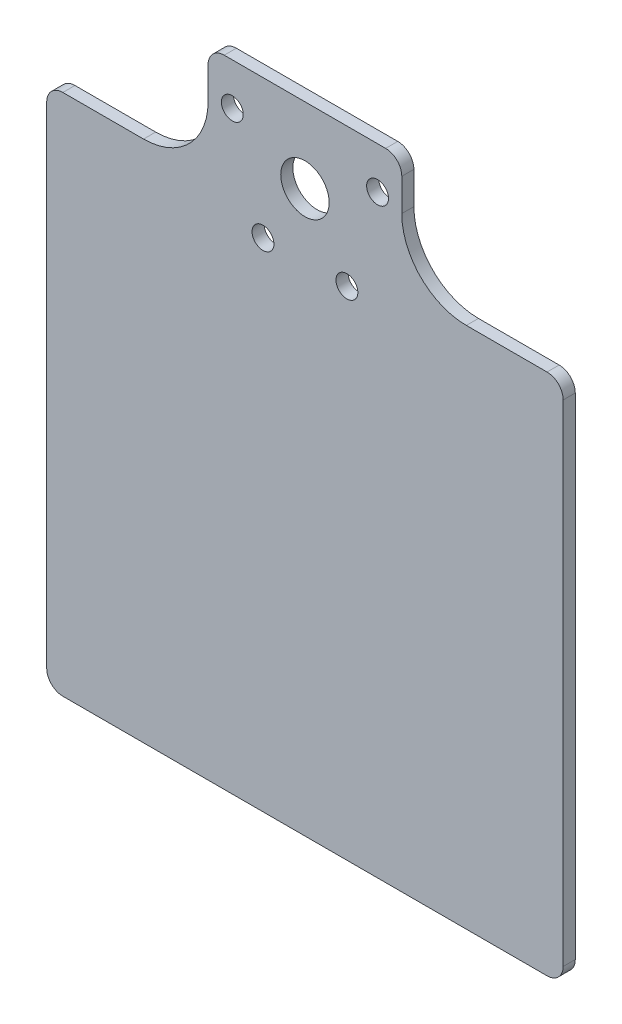
ISO-10303-21;
HEADER;
FILE_DESCRIPTION(('STEP AP214'),'2;1');
FILE_NAME('part.step','',(''),(''),'','','');
FILE_SCHEMA(('AUTOMOTIVE_DESIGN { 1 0 10303 214 1 1 1 1 }'));
ENDSEC;
DATA;
#1=APPLICATION_CONTEXT('core data for automotive mechanical design processes');
#2=APPLICATION_PROTOCOL_DEFINITION('international standard','automotive_design',2000,#1);
#3=PRODUCT_CONTEXT('',#1,'mechanical');
#4=PRODUCT('Part','Part','',(#3));
#5=PRODUCT_RELATED_PRODUCT_CATEGORY('part','',(#4));
#6=PRODUCT_DEFINITION_FORMATION('','',#4);
#7=PRODUCT_DEFINITION_CONTEXT('part definition',#1,'design');
#8=PRODUCT_DEFINITION('design','',#6,#7);
#9=PRODUCT_DEFINITION_SHAPE('','',#8);
#10=(LENGTH_UNIT() NAMED_UNIT(*) SI_UNIT(.MILLI.,.METRE.));
#11=(NAMED_UNIT(*) PLANE_ANGLE_UNIT() SI_UNIT($,.RADIAN.));
#12=(NAMED_UNIT(*) SI_UNIT($,.STERADIAN.) SOLID_ANGLE_UNIT());
#13=UNCERTAINTY_MEASURE_WITH_UNIT(LENGTH_MEASURE(1.E-05),#10,'distance_accuracy_value','');
#14=(GEOMETRIC_REPRESENTATION_CONTEXT(3) GLOBAL_UNCERTAINTY_ASSIGNED_CONTEXT((#13)) GLOBAL_UNIT_ASSIGNED_CONTEXT((#10,
#11,#12)) REPRESENTATION_CONTEXT('',''));
#15=CARTESIAN_POINT('',(0.,0.,0.));
#16=DIRECTION('',(0.,0.,1.));
#17=DIRECTION('',(1.,0.,0.));
#18=AXIS2_PLACEMENT_3D('',#15,#16,#17);
#19=CARTESIAN_POINT('',(19.05,-17.4625,2.38125));
#20=DIRECTION('',(-1.,0.,0.));
#21=DIRECTION('',(0.,0.,1.));
#22=AXIS2_PLACEMENT_3D('',#19,#20,#21);
#23=PLANE('',#22);
#24=DIRECTION('',(0.,1.,0.));
#25=VECTOR('',#24,1.);
#26=CARTESIAN_POINT('',(19.05,-17.4625,2.38125));
#27=LINE('',#26,#25);
#28=CARTESIAN_POINT('',(19.05,7.9375,2.38125));
#29=VERTEX_POINT('',#28);
#30=CARTESIAN_POINT('',(19.05,14.2875,2.38125));
#31=VERTEX_POINT('',#30);
#32=EDGE_CURVE('E214',#29,#31,#27,.T.);
#33=ORIENTED_EDGE('',*,*,#32,.F.);
#34=DIRECTION('',(0.,0.,1.));
#35=VECTOR('',#34,1.);
#36=CARTESIAN_POINT('',(19.05,7.9375,2.38125));
#37=LINE('',#36,#35);
#38=CARTESIAN_POINT('',(19.05,7.9375,0.));
#39=VERTEX_POINT('',#38);
#40=EDGE_CURVE('E210',#29,#39,#37,.F.);
#41=ORIENTED_EDGE('',*,*,#40,.T.);
#42=DIRECTION('',(0.,1.,0.));
#43=VECTOR('',#42,1.);
#44=CARTESIAN_POINT('',(19.05,-17.4625,0.));
#45=LINE('',#44,#43);
#46=CARTESIAN_POINT('',(19.05,14.2875,0.));
#47=VERTEX_POINT('',#46);
#48=EDGE_CURVE('E166',#39,#47,#45,.T.);
#49=ORIENTED_EDGE('',*,*,#48,.T.);
#50=DIRECTION('',(0.,0.,-1.));
#51=VECTOR('',#50,1.);
#52=CARTESIAN_POINT('',(19.05,14.2875,2.38125));
#53=LINE('',#52,#51);
#54=EDGE_CURVE('E204',#47,#31,#53,.F.);
#55=ORIENTED_EDGE('',*,*,#54,.T.);
#56=EDGE_LOOP('',(#33,#41,#49,#55));
#57=FACE_BOUND('',#56,.T.);
#58=ADVANCED_FACE('F32',(#57),#23,.F.);
#59=CARTESIAN_POINT('',(-19.05,17.4625,2.38125));
#60=DIRECTION('',(0.,-1.,0.));
#61=DIRECTION('',(0.,0.,-1.));
#62=AXIS2_PLACEMENT_3D('',#59,#60,#61);
#63=PLANE('',#62);
#64=DIRECTION('',(-1.,0.,0.));
#65=VECTOR('',#64,1.);
#66=CARTESIAN_POINT('',(-19.05,17.4625,0.));
#67=LINE('',#66,#65);
#68=CARTESIAN_POINT('',(15.875,17.4625,0.));
#69=VERTEX_POINT('',#68);
#70=CARTESIAN_POINT('',(-15.875,17.4625,0.));
#71=VERTEX_POINT('',#70);
#72=EDGE_CURVE('E213',#69,#71,#67,.T.);
#73=ORIENTED_EDGE('',*,*,#72,.T.);
#74=DIRECTION('',(0.,0.,-1.));
#75=VECTOR('',#74,1.);
#76=CARTESIAN_POINT('',(-15.875,17.4625,2.38125));
#77=LINE('',#76,#75);
#78=CARTESIAN_POINT('',(-15.875,17.4625,2.38125));
#79=VERTEX_POINT('',#78);
#80=EDGE_CURVE('E202',#71,#79,#77,.F.);
#81=ORIENTED_EDGE('',*,*,#80,.T.);
#82=DIRECTION('',(-1.,0.,0.));
#83=VECTOR('',#82,1.);
#84=CARTESIAN_POINT('',(-19.05,17.4625,2.38125));
#85=LINE('',#84,#83);
#86=CARTESIAN_POINT('',(15.875,17.4625,2.38125));
#87=VERTEX_POINT('',#86);
#88=EDGE_CURVE('E224',#87,#79,#85,.T.);
#89=ORIENTED_EDGE('',*,*,#88,.F.);
#90=DIRECTION('',(0.,0.,-1.));
#91=VECTOR('',#90,1.);
#92=CARTESIAN_POINT('',(15.875,17.4625,2.38125));
#93=LINE('',#92,#91);
#94=EDGE_CURVE('E199',#87,#69,#93,.T.);
#95=ORIENTED_EDGE('',*,*,#94,.T.);
#96=EDGE_LOOP('',(#73,#81,#89,#95));
#97=FACE_BOUND('',#96,.T.);
#98=ADVANCED_FACE('F266',(#97),#63,.F.);
#99=CARTESIAN_POINT('',(-19.05,-17.4625,2.38125));
#100=DIRECTION('',(1.,0.,0.));
#101=DIRECTION('',(0.,0.,-1.));
#102=AXIS2_PLACEMENT_3D('',#99,#100,#101);
#103=PLANE('',#102);
#104=DIRECTION('',(0.,-1.,0.));
#105=VECTOR('',#104,1.);
#106=CARTESIAN_POINT('',(-19.05,-17.4625,0.));
#107=LINE('',#106,#105);
#108=CARTESIAN_POINT('',(-19.05,14.2875,0.));
#109=VERTEX_POINT('',#108);
#110=CARTESIAN_POINT('',(-19.05,7.9375,0.));
#111=VERTEX_POINT('',#110);
#112=EDGE_CURVE('E232',#109,#111,#107,.T.);
#113=ORIENTED_EDGE('',*,*,#112,.T.);
#114=DIRECTION('',(0.,0.,1.));
#115=VECTOR('',#114,1.);
#116=CARTESIAN_POINT('',(-19.05,7.9375,2.38125));
#117=LINE('',#116,#115);
#118=CARTESIAN_POINT('',(-19.05,7.9375,2.38125));
#119=VERTEX_POINT('',#118);
#120=EDGE_CURVE('E281',#111,#119,#117,.T.);
#121=ORIENTED_EDGE('',*,*,#120,.T.);
#122=DIRECTION('',(0.,-1.,0.));
#123=VECTOR('',#122,1.);
#124=CARTESIAN_POINT('',(-19.05,-17.4625,2.38125));
#125=LINE('',#124,#123);
#126=CARTESIAN_POINT('',(-19.05,14.2875,2.38125));
#127=VERTEX_POINT('',#126);
#128=EDGE_CURVE('E155',#127,#119,#125,.T.);
#129=ORIENTED_EDGE('',*,*,#128,.F.);
#130=DIRECTION('',(0.,0.,-1.));
#131=VECTOR('',#130,1.);
#132=CARTESIAN_POINT('',(-19.05,14.2875,2.38125));
#133=LINE('',#132,#131);
#134=EDGE_CURVE('E196',#127,#109,#133,.T.);
#135=ORIENTED_EDGE('',*,*,#134,.T.);
#136=EDGE_LOOP('',(#113,#121,#129,#135));
#137=FACE_BOUND('',#136,.T.);
#138=ADVANCED_FACE('F285',(#137),#103,.F.);
#139=CARTESIAN_POINT('',(19.05,17.4625,2.38125));
#140=DIRECTION('',(0.,0.,-1.));
#141=DIRECTION('',(-1.,0.,0.));
#142=AXIS2_PLACEMENT_3D('',#139,#140,#141);
#143=PLANE('',#142);
#144=DIRECTION('',(0.,1.,0.));
#145=VECTOR('',#144,1.);
#146=CARTESIAN_POINT('',(50.8,-107.6325,2.38125));
#147=LINE('',#146,#145);
#148=CARTESIAN_POINT('',(50.8,-104.4575,2.38125));
#149=VERTEX_POINT('',#148);
#150=CARTESIAN_POINT('',(50.8,-7.9375,2.38125));
#151=VERTEX_POINT('',#150);
#152=EDGE_CURVE('E151',#149,#151,#147,.T.);
#153=ORIENTED_EDGE('',*,*,#152,.T.);
#154=CARTESIAN_POINT('',(47.625,-7.9375,2.38125));
#155=DIRECTION('',(0.,0.,-1.));
#156=DIRECTION('',(-1.,0.,0.));
#157=AXIS2_PLACEMENT_3D('',#154,#155,#156);
#158=CIRCLE('',#157,3.175);
#159=CARTESIAN_POINT('',(47.625,-4.7625,2.38125));
#160=VERTEX_POINT('',#159);
#161=EDGE_CURVE('E241',#151,#160,#158,.F.);
#162=ORIENTED_EDGE('',*,*,#161,.T.);
#163=DIRECTION('',(-1.,0.,0.));
#164=VECTOR('',#163,1.);
#165=CARTESIAN_POINT('',(50.8,-4.7625,2.38125));
#166=LINE('',#165,#164);
#167=CARTESIAN_POINT('',(31.75,-4.7625,2.38125));
#168=VERTEX_POINT('',#167);
#169=EDGE_CURVE('E600',#160,#168,#166,.T.);
#170=ORIENTED_EDGE('',*,*,#169,.T.);
#171=CARTESIAN_POINT('',(31.75,7.93749999999999,2.38125));
#172=DIRECTION('',(0.,0.,-1.));
#173=DIRECTION('',(-1.,0.,0.));
#174=AXIS2_PLACEMENT_3D('',#171,#172,#173);
#175=CIRCLE('',#174,12.7);
#176=EDGE_CURVE('E276',#168,#29,#175,.T.);
#177=ORIENTED_EDGE('',*,*,#176,.T.);
#178=ORIENTED_EDGE('',*,*,#32,.T.);
#179=CARTESIAN_POINT('',(15.875,14.2875,2.38125));
#180=DIRECTION('',(0.,0.,-1.));
#181=DIRECTION('',(-1.,0.,0.));
#182=AXIS2_PLACEMENT_3D('',#179,#180,#181);
#183=CIRCLE('',#182,3.175);
#184=EDGE_CURVE('E222',#31,#87,#183,.F.);
#185=ORIENTED_EDGE('',*,*,#184,.T.);
#186=ORIENTED_EDGE('',*,*,#88,.T.);
#187=CARTESIAN_POINT('',(-15.875,14.2875,2.38125));
#188=DIRECTION('',(0.,0.,-1.));
#189=DIRECTION('',(-1.,0.,0.));
#190=AXIS2_PLACEMENT_3D('',#187,#188,#189);
#191=CIRCLE('',#190,3.175);
#192=EDGE_CURVE('E253',#79,#127,#191,.F.);
#193=ORIENTED_EDGE('',*,*,#192,.T.);
#194=ORIENTED_EDGE('',*,*,#128,.T.);
#195=CARTESIAN_POINT('',(-31.75,7.9375,2.38125));
#196=DIRECTION('',(0.,0.,-1.));
#197=DIRECTION('',(-1.,0.,0.));
#198=AXIS2_PLACEMENT_3D('',#195,#196,#197);
#199=CIRCLE('',#198,12.7);
#200=CARTESIAN_POINT('',(-31.75,-4.7625,2.38125));
#201=VERTEX_POINT('',#200);
#202=EDGE_CURVE('E40',#119,#201,#199,.T.);
#203=ORIENTED_EDGE('',*,*,#202,.T.);
#204=DIRECTION('',(-1.,0.,0.));
#205=VECTOR('',#204,1.);
#206=CARTESIAN_POINT('',(-50.8,-4.7625,2.38125));
#207=LINE('',#206,#205);
#208=CARTESIAN_POINT('',(-47.625,-4.7625,2.38125));
#209=VERTEX_POINT('',#208);
#210=EDGE_CURVE('E295',#201,#209,#207,.T.);
#211=ORIENTED_EDGE('',*,*,#210,.T.);
#212=CARTESIAN_POINT('',(-47.625,-7.9375,2.38125));
#213=DIRECTION('',(0.,0.,-1.));
#214=DIRECTION('',(-1.,0.,0.));
#215=AXIS2_PLACEMENT_3D('',#212,#213,#214);
#216=CIRCLE('',#215,3.175);
#217=CARTESIAN_POINT('',(-50.8,-7.9375,2.38125));
#218=VERTEX_POINT('',#217);
#219=EDGE_CURVE('E246',#209,#218,#216,.F.);
#220=ORIENTED_EDGE('',*,*,#219,.T.);
#221=DIRECTION('',(0.,-1.,0.));
#222=VECTOR('',#221,1.);
#223=CARTESIAN_POINT('',(-50.8,-107.6325,2.38125));
#224=LINE('',#223,#222);
#225=CARTESIAN_POINT('',(-50.8,-104.4575,2.38125));
#226=VERTEX_POINT('',#225);
#227=EDGE_CURVE('E334',#218,#226,#224,.T.);
#228=ORIENTED_EDGE('',*,*,#227,.T.);
#229=CARTESIAN_POINT('',(-47.625,-104.4575,2.38125));
#230=DIRECTION('',(0.,0.,-1.));
#231=DIRECTION('',(-1.,0.,0.));
#232=AXIS2_PLACEMENT_3D('',#229,#230,#231);
#233=CIRCLE('',#232,3.175);
#234=CARTESIAN_POINT('',(-47.625,-107.6325,2.38125));
#235=VERTEX_POINT('',#234);
#236=EDGE_CURVE('E248',#226,#235,#233,.F.);
#237=ORIENTED_EDGE('',*,*,#236,.T.);
#238=DIRECTION('',(1.,0.,0.));
#239=VECTOR('',#238,1.);
#240=CARTESIAN_POINT('',(-50.8,-107.6325,2.38125));
#241=LINE('',#240,#239);
#242=CARTESIAN_POINT('',(47.625,-107.6325,2.38125));
#243=VERTEX_POINT('',#242);
#244=EDGE_CURVE('E330',#235,#243,#241,.T.);
#245=ORIENTED_EDGE('',*,*,#244,.T.);
#246=CARTESIAN_POINT('',(47.625,-104.4575,2.38125));
#247=DIRECTION('',(0.,0.,-1.));
#248=DIRECTION('',(-1.,0.,0.));
#249=AXIS2_PLACEMENT_3D('',#246,#247,#248);
#250=CIRCLE('',#249,3.175);
#251=EDGE_CURVE('E252',#243,#149,#250,.F.);
#252=ORIENTED_EDGE('',*,*,#251,.T.);
#253=EDGE_LOOP('',(#153,#162,#170,#177,#178,#185,#186,#193,#194,#203,#211,#220,#228,#237,#245,#252));
#254=FACE_BOUND('',#253,.T.);
#255=CARTESIAN_POINT('',(8.255,-9.84250000000001,2.38125));
#256=DIRECTION('',(0.,0.,-1.));
#257=DIRECTION('',(-1.,0.,0.));
#258=AXIS2_PLACEMENT_3D('',#255,#256,#257);
#259=CIRCLE('',#258,2.15265);
#260=CARTESIAN_POINT('',(6.10235,-9.84250000000001,2.38125));
#261=VERTEX_POINT('',#260);
#262=EDGE_CURVE('E298',#261,#261,#259,.T.);
#263=ORIENTED_EDGE('',*,*,#262,.T.);
#264=EDGE_LOOP('',(#263));
#265=FACE_BOUND('',#264,.T.);
#266=CARTESIAN_POINT('',(-8.255,-9.8425,2.38125));
#267=DIRECTION('',(0.,0.,-1.));
#268=DIRECTION('',(-1.,0.,0.));
#269=AXIS2_PLACEMENT_3D('',#266,#267,#268);
#270=CIRCLE('',#269,2.15265);
#271=CARTESIAN_POINT('',(-10.40765,-9.8425,2.38125));
#272=VERTEX_POINT('',#271);
#273=EDGE_CURVE('E309',#272,#272,#270,.T.);
#274=ORIENTED_EDGE('',*,*,#273,.T.);
#275=EDGE_LOOP('',(#274));
#276=FACE_BOUND('',#275,.T.);
#277=CARTESIAN_POINT('',(14.2875,9.20749999999999,2.38125));
#278=DIRECTION('',(0.,0.,-1.));
#279=DIRECTION('',(-1.,0.,0.));
#280=AXIS2_PLACEMENT_3D('',#277,#278,#279);
#281=CIRCLE('',#280,2.15265);
#282=CARTESIAN_POINT('',(12.13485,9.20749999999999,2.38125));
#283=VERTEX_POINT('',#282);
#284=EDGE_CURVE('E315',#283,#283,#281,.T.);
#285=ORIENTED_EDGE('',*,*,#284,.T.);
#286=EDGE_LOOP('',(#285));
#287=FACE_BOUND('',#286,.T.);
#288=CARTESIAN_POINT('',(-14.2875,9.20749999999999,2.38125));
#289=DIRECTION('',(0.,0.,-1.));
#290=DIRECTION('',(-1.,0.,0.));
#291=AXIS2_PLACEMENT_3D('',#288,#289,#290);
#292=CIRCLE('',#291,2.15265);
#293=CARTESIAN_POINT('',(-16.44015,9.20749999999999,2.38125));
#294=VERTEX_POINT('',#293);
#295=EDGE_CURVE('E321',#294,#294,#292,.T.);
#296=ORIENTED_EDGE('',*,*,#295,.T.);
#297=EDGE_LOOP('',(#296));
#298=FACE_BOUND('',#297,.T.);
#299=CARTESIAN_POINT('',(0.,2.6543,2.38125));
#300=DIRECTION('',(0.,0.,-1.));
#301=DIRECTION('',(-1.,0.,0.));
#302=AXIS2_PLACEMENT_3D('',#299,#300,#301);
#303=CIRCLE('',#302,4.7625);
#304=CARTESIAN_POINT('',(-4.7625,2.6543,2.38125));
#305=VERTEX_POINT('',#304);
#306=EDGE_CURVE('E327',#305,#305,#303,.F.);
#307=ORIENTED_EDGE('',*,*,#306,.F.);
#308=EDGE_LOOP('',(#307));
#309=FACE_BOUND('',#308,.T.);
#310=ADVANCED_FACE('F259',(#254,#265,#276,#287,#298,#309),#143,.F.);
#311=CARTESIAN_POINT('',(19.05,17.4625,0.));
#312=DIRECTION('',(0.,0.,-1.));
#313=DIRECTION('',(-1.,0.,0.));
#314=AXIS2_PLACEMENT_3D('',#311,#312,#313);
#315=PLANE('',#314);
#316=DIRECTION('',(-1.,0.,0.));
#317=VECTOR('',#316,1.);
#318=CARTESIAN_POINT('',(50.8,-4.7625,0.));
#319=LINE('',#318,#317);
#320=CARTESIAN_POINT('',(47.625,-4.7625,0.));
#321=VERTEX_POINT('',#320);
#322=CARTESIAN_POINT('',(31.75,-4.7625,0.));
#323=VERTEX_POINT('',#322);
#324=EDGE_CURVE('E300',#321,#323,#319,.T.);
#325=ORIENTED_EDGE('',*,*,#324,.F.);
#326=CARTESIAN_POINT('',(47.625,-7.9375,0.));
#327=DIRECTION('',(0.,0.,-1.));
#328=DIRECTION('',(-1.,0.,0.));
#329=AXIS2_PLACEMENT_3D('',#326,#327,#328);
#330=CIRCLE('',#329,3.175);
#331=CARTESIAN_POINT('',(50.8,-7.9375,0.));
#332=VERTEX_POINT('',#331);
#333=EDGE_CURVE('E165',#321,#332,#330,.T.);
#334=ORIENTED_EDGE('',*,*,#333,.T.);
#335=DIRECTION('',(0.,1.,0.));
#336=VECTOR('',#335,1.);
#337=CARTESIAN_POINT('',(50.8,-107.6325,0.));
#338=LINE('',#337,#336);
#339=CARTESIAN_POINT('',(50.8,-104.4575,0.));
#340=VERTEX_POINT('',#339);
#341=EDGE_CURVE('E148',#340,#332,#338,.T.);
#342=ORIENTED_EDGE('',*,*,#341,.F.);
#343=CARTESIAN_POINT('',(47.625,-104.4575,0.));
#344=DIRECTION('',(0.,0.,-1.));
#345=DIRECTION('',(-1.,0.,0.));
#346=AXIS2_PLACEMENT_3D('',#343,#344,#345);
#347=CIRCLE('',#346,3.175);
#348=CARTESIAN_POINT('',(47.625,-107.6325,0.));
#349=VERTEX_POINT('',#348);
#350=EDGE_CURVE('E162',#340,#349,#347,.T.);
#351=ORIENTED_EDGE('',*,*,#350,.T.);
#352=DIRECTION('',(1.,0.,0.));
#353=VECTOR('',#352,1.);
#354=CARTESIAN_POINT('',(-50.8,-107.6325,0.));
#355=LINE('',#354,#353);
#356=CARTESIAN_POINT('',(-47.625,-107.6325,0.));
#357=VERTEX_POINT('',#356);
#358=EDGE_CURVE('E167',#357,#349,#355,.T.);
#359=ORIENTED_EDGE('',*,*,#358,.F.);
#360=CARTESIAN_POINT('',(-47.625,-104.4575,0.));
#361=DIRECTION('',(0.,0.,-1.));
#362=DIRECTION('',(-1.,0.,0.));
#363=AXIS2_PLACEMENT_3D('',#360,#361,#362);
#364=CIRCLE('',#363,3.175);
#365=CARTESIAN_POINT('',(-50.8,-104.4575,0.));
#366=VERTEX_POINT('',#365);
#367=EDGE_CURVE('E173',#357,#366,#364,.T.);
#368=ORIENTED_EDGE('',*,*,#367,.T.);
#369=DIRECTION('',(0.,-1.,0.));
#370=VECTOR('',#369,1.);
#371=CARTESIAN_POINT('',(-50.8,-107.6325,0.));
#372=LINE('',#371,#370);
#373=CARTESIAN_POINT('',(-50.8,-7.9375,0.));
#374=VERTEX_POINT('',#373);
#375=EDGE_CURVE('E333',#374,#366,#372,.T.);
#376=ORIENTED_EDGE('',*,*,#375,.F.);
#377=CARTESIAN_POINT('',(-47.625,-7.9375,0.));
#378=DIRECTION('',(0.,0.,-1.));
#379=DIRECTION('',(-1.,0.,0.));
#380=AXIS2_PLACEMENT_3D('',#377,#378,#379);
#381=CIRCLE('',#380,3.175);
#382=CARTESIAN_POINT('',(-47.625,-4.7625,0.));
#383=VERTEX_POINT('',#382);
#384=EDGE_CURVE('E176',#374,#383,#381,.T.);
#385=ORIENTED_EDGE('',*,*,#384,.T.);
#386=DIRECTION('',(-1.,0.,0.));
#387=VECTOR('',#386,1.);
#388=CARTESIAN_POINT('',(-50.8,-4.7625,0.));
#389=LINE('',#388,#387);
#390=CARTESIAN_POINT('',(-31.75,-4.7625,0.));
#391=VERTEX_POINT('',#390);
#392=EDGE_CURVE('E290',#391,#383,#389,.T.);
#393=ORIENTED_EDGE('',*,*,#392,.F.);
#394=CARTESIAN_POINT('',(-31.75,7.9375,0.));
#395=DIRECTION('',(0.,0.,-1.));
#396=DIRECTION('',(-1.,0.,0.));
#397=AXIS2_PLACEMENT_3D('',#394,#395,#396);
#398=CIRCLE('',#397,12.7);
#399=EDGE_CURVE('E11',#391,#111,#398,.F.);
#400=ORIENTED_EDGE('',*,*,#399,.T.);
#401=ORIENTED_EDGE('',*,*,#112,.F.);
#402=CARTESIAN_POINT('',(-15.875,14.2875,0.));
#403=DIRECTION('',(0.,0.,-1.));
#404=DIRECTION('',(-1.,0.,0.));
#405=AXIS2_PLACEMENT_3D('',#402,#403,#404);
#406=CIRCLE('',#405,3.175);
#407=EDGE_CURVE('E174',#109,#71,#406,.T.);
#408=ORIENTED_EDGE('',*,*,#407,.T.);
#409=ORIENTED_EDGE('',*,*,#72,.F.);
#410=CARTESIAN_POINT('',(15.875,14.2875,0.));
#411=DIRECTION('',(0.,0.,-1.));
#412=DIRECTION('',(-1.,0.,0.));
#413=AXIS2_PLACEMENT_3D('',#410,#411,#412);
#414=CIRCLE('',#413,3.175);
#415=EDGE_CURVE('E178',#69,#47,#414,.T.);
#416=ORIENTED_EDGE('',*,*,#415,.T.);
#417=ORIENTED_EDGE('',*,*,#48,.F.);
#418=CARTESIAN_POINT('',(31.75,7.93749999999999,0.));
#419=DIRECTION('',(0.,0.,-1.));
#420=DIRECTION('',(-1.,0.,0.));
#421=AXIS2_PLACEMENT_3D('',#418,#419,#420);
#422=CIRCLE('',#421,12.7);
#423=EDGE_CURVE('E272',#39,#323,#422,.F.);
#424=ORIENTED_EDGE('',*,*,#423,.T.);
#425=EDGE_LOOP('',(#325,#334,#342,#351,#359,#368,#376,#385,#393,#400,#401,#408,#409,#416,#417,#424));
#426=FACE_BOUND('',#425,.T.);
#427=CARTESIAN_POINT('',(8.255,-9.84250000000001,0.));
#428=DIRECTION('',(0.,0.,-1.));
#429=DIRECTION('',(-1.,0.,0.));
#430=AXIS2_PLACEMENT_3D('',#427,#428,#429);
#431=CIRCLE('',#430,2.15265);
#432=CARTESIAN_POINT('',(6.10235,-9.84250000000001,0.));
#433=VERTEX_POINT('',#432);
#434=EDGE_CURVE('E294',#433,#433,#431,.T.);
#435=ORIENTED_EDGE('',*,*,#434,.F.);
#436=EDGE_LOOP('',(#435));
#437=FACE_BOUND('',#436,.T.);
#438=CARTESIAN_POINT('',(-8.255,-9.8425,0.));
#439=DIRECTION('',(0.,0.,-1.));
#440=DIRECTION('',(-1.,0.,0.));
#441=AXIS2_PLACEMENT_3D('',#438,#439,#440);
#442=CIRCLE('',#441,2.15265);
#443=CARTESIAN_POINT('',(-10.40765,-9.8425,0.));
#444=VERTEX_POINT('',#443);
#445=EDGE_CURVE('E306',#444,#444,#442,.T.);
#446=ORIENTED_EDGE('',*,*,#445,.F.);
#447=EDGE_LOOP('',(#446));
#448=FACE_BOUND('',#447,.T.);
#449=CARTESIAN_POINT('',(14.2875,9.20749999999999,0.));
#450=DIRECTION('',(0.,0.,-1.));
#451=DIRECTION('',(-1.,0.,0.));
#452=AXIS2_PLACEMENT_3D('',#449,#450,#451);
#453=CIRCLE('',#452,2.15265);
#454=CARTESIAN_POINT('',(12.13485,9.20749999999999,0.));
#455=VERTEX_POINT('',#454);
#456=EDGE_CURVE('E312',#455,#455,#453,.T.);
#457=ORIENTED_EDGE('',*,*,#456,.F.);
#458=EDGE_LOOP('',(#457));
#459=FACE_BOUND('',#458,.T.);
#460=CARTESIAN_POINT('',(-14.2875,9.20749999999999,0.));
#461=DIRECTION('',(0.,0.,-1.));
#462=DIRECTION('',(-1.,0.,0.));
#463=AXIS2_PLACEMENT_3D('',#460,#461,#462);
#464=CIRCLE('',#463,2.15265);
#465=CARTESIAN_POINT('',(-16.44015,9.20749999999999,0.));
#466=VERTEX_POINT('',#465);
#467=EDGE_CURVE('E318',#466,#466,#464,.T.);
#468=ORIENTED_EDGE('',*,*,#467,.F.);
#469=EDGE_LOOP('',(#468));
#470=FACE_BOUND('',#469,.T.);
#471=CARTESIAN_POINT('',(0.,2.6543,0.));
#472=DIRECTION('',(0.,0.,-1.));
#473=DIRECTION('',(-1.,0.,0.));
#474=AXIS2_PLACEMENT_3D('',#471,#472,#473);
#475=CIRCLE('',#474,4.7625);
#476=CARTESIAN_POINT('',(-4.7625,2.6543,0.));
#477=VERTEX_POINT('',#476);
#478=EDGE_CURVE('E324',#477,#477,#475,.T.);
#479=ORIENTED_EDGE('',*,*,#478,.F.);
#480=EDGE_LOOP('',(#479));
#481=FACE_BOUND('',#480,.T.);
#482=ADVANCED_FACE('F159',(#426,#437,#448,#459,#470,#481),#315,.T.);
#483=CARTESIAN_POINT('',(-50.8,-107.6325,-135.842515068001));
#484=DIRECTION('',(-1.,0.,0.));
#485=DIRECTION('',(0.,-1.,0.));
#486=AXIS2_PLACEMENT_3D('',#483,#484,#485);
#487=PLANE('',#486);
#488=ORIENTED_EDGE('',*,*,#227,.F.);
#489=DIRECTION('',(0.,0.,1.));
#490=VECTOR('',#489,1.);
#491=CARTESIAN_POINT('',(-50.8,-7.9375,-135.842515068001));
#492=LINE('',#491,#490);
#493=EDGE_CURVE('E191',#218,#374,#492,.F.);
#494=ORIENTED_EDGE('',*,*,#493,.T.);
#495=ORIENTED_EDGE('',*,*,#375,.T.);
#496=DIRECTION('',(0.,0.,1.));
#497=VECTOR('',#496,1.);
#498=CARTESIAN_POINT('',(-50.8,-104.4575,-135.842515068001));
#499=LINE('',#498,#497);
#500=EDGE_CURVE('E188',#366,#226,#499,.T.);
#501=ORIENTED_EDGE('',*,*,#500,.T.);
#502=EDGE_LOOP('',(#488,#494,#495,#501));
#503=FACE_BOUND('',#502,.T.);
#504=ADVANCED_FACE('F343',(#503),#487,.T.);
#505=CARTESIAN_POINT('',(-50.8,-107.6325,-135.842515068001));
#506=DIRECTION('',(0.,-1.,0.));
#507=DIRECTION('',(0.,0.,-1.));
#508=AXIS2_PLACEMENT_3D('',#505,#506,#507);
#509=PLANE('',#508);
#510=ORIENTED_EDGE('',*,*,#244,.F.);
#511=DIRECTION('',(0.,0.,1.));
#512=VECTOR('',#511,1.);
#513=CARTESIAN_POINT('',(-47.625,-107.6325,-135.842515068001));
#514=LINE('',#513,#512);
#515=EDGE_CURVE('E194',#235,#357,#514,.F.);
#516=ORIENTED_EDGE('',*,*,#515,.T.);
#517=ORIENTED_EDGE('',*,*,#358,.T.);
#518=DIRECTION('',(0.,0.,1.));
#519=VECTOR('',#518,1.);
#520=CARTESIAN_POINT('',(47.625,-107.6325,-135.842515068001));
#521=LINE('',#520,#519);
#522=EDGE_CURVE('E172',#349,#243,#521,.T.);
#523=ORIENTED_EDGE('',*,*,#522,.T.);
#524=EDGE_LOOP('',(#510,#516,#517,#523));
#525=FACE_BOUND('',#524,.T.);
#526=ADVANCED_FACE('F351',(#525),#509,.T.);
#527=CARTESIAN_POINT('',(50.8,-107.6325,-135.842515068001));
#528=DIRECTION('',(1.,0.,0.));
#529=DIRECTION('',(0.,0.,-1.));
#530=AXIS2_PLACEMENT_3D('',#527,#528,#529);
#531=PLANE('',#530);
#532=ORIENTED_EDGE('',*,*,#341,.T.);
#533=DIRECTION('',(0.,0.,1.));
#534=VECTOR('',#533,1.);
#535=CARTESIAN_POINT('',(50.8,-7.9375,-135.842515068001));
#536=LINE('',#535,#534);
#537=EDGE_CURVE('E154',#332,#151,#536,.T.);
#538=ORIENTED_EDGE('',*,*,#537,.T.);
#539=ORIENTED_EDGE('',*,*,#152,.F.);
#540=DIRECTION('',(0.,0.,1.));
#541=VECTOR('',#540,1.);
#542=CARTESIAN_POINT('',(50.8,-104.4575,-135.842515068001));
#543=LINE('',#542,#541);
#544=EDGE_CURVE('E144',#149,#340,#543,.F.);
#545=ORIENTED_EDGE('',*,*,#544,.T.);
#546=EDGE_LOOP('',(#532,#538,#539,#545));
#547=FACE_BOUND('',#546,.T.);
#548=ADVANCED_FACE('F146',(#547),#531,.T.);
#549=CARTESIAN_POINT('',(0.,2.6543,2.3823));
#550=DIRECTION('',(0.,0.,-1.));
#551=DIRECTION('',(-1.,0.,0.));
#552=AXIS2_PLACEMENT_3D('',#549,#550,#551);
#553=CYLINDRICAL_SURFACE('',#552,4.7625);
#554=ORIENTED_EDGE('',*,*,#478,.T.);
#555=EDGE_LOOP('',(#554));
#556=FACE_BOUND('',#555,.T.);
#557=ORIENTED_EDGE('',*,*,#306,.T.);
#558=EDGE_LOOP('',(#557));
#559=FACE_BOUND('',#558,.T.);
#560=ADVANCED_FACE('F358',(#556,#559),#553,.F.);
#561=CARTESIAN_POINT('',(-14.2875,9.20749999999999,0.));
#562=DIRECTION('',(0.,0.,-1.));
#563=DIRECTION('',(-1.,0.,0.));
#564=AXIS2_PLACEMENT_3D('',#561,#562,#563);
#565=CYLINDRICAL_SURFACE('',#564,2.15265);
#566=ORIENTED_EDGE('',*,*,#467,.T.);
#567=EDGE_LOOP('',(#566));
#568=FACE_BOUND('',#567,.T.);
#569=ORIENTED_EDGE('',*,*,#295,.F.);
#570=EDGE_LOOP('',(#569));
#571=FACE_BOUND('',#570,.T.);
#572=ADVANCED_FACE('F535',(#568,#571),#565,.F.);
#573=CARTESIAN_POINT('',(14.2875,9.20749999999999,0.));
#574=DIRECTION('',(0.,0.,-1.));
#575=DIRECTION('',(-1.,0.,0.));
#576=AXIS2_PLACEMENT_3D('',#573,#574,#575);
#577=CYLINDRICAL_SURFACE('',#576,2.15265);
#578=ORIENTED_EDGE('',*,*,#456,.T.);
#579=EDGE_LOOP('',(#578));
#580=FACE_BOUND('',#579,.T.);
#581=ORIENTED_EDGE('',*,*,#284,.F.);
#582=EDGE_LOOP('',(#581));
#583=FACE_BOUND('',#582,.T.);
#584=ADVANCED_FACE('F525',(#580,#583),#577,.F.);
#585=CARTESIAN_POINT('',(-8.255,-9.8425,0.));
#586=DIRECTION('',(0.,0.,-1.));
#587=DIRECTION('',(-1.,0.,0.));
#588=AXIS2_PLACEMENT_3D('',#585,#586,#587);
#589=CYLINDRICAL_SURFACE('',#588,2.15265);
#590=ORIENTED_EDGE('',*,*,#445,.T.);
#591=EDGE_LOOP('',(#590));
#592=FACE_BOUND('',#591,.T.);
#593=ORIENTED_EDGE('',*,*,#273,.F.);
#594=EDGE_LOOP('',(#593));
#595=FACE_BOUND('',#594,.T.);
#596=ADVANCED_FACE('F515',(#592,#595),#589,.F.);
#597=CARTESIAN_POINT('',(8.255,-9.84250000000001,0.));
#598=DIRECTION('',(0.,0.,-1.));
#599=DIRECTION('',(-1.,0.,0.));
#600=AXIS2_PLACEMENT_3D('',#597,#598,#599);
#601=CYLINDRICAL_SURFACE('',#600,2.15265);
#602=ORIENTED_EDGE('',*,*,#434,.T.);
#603=EDGE_LOOP('',(#602));
#604=FACE_BOUND('',#603,.T.);
#605=ORIENTED_EDGE('',*,*,#262,.F.);
#606=EDGE_LOOP('',(#605));
#607=FACE_BOUND('',#606,.T.);
#608=ADVANCED_FACE('F417',(#604,#607),#601,.F.);
#609=CARTESIAN_POINT('',(-50.8,-4.7625,-34.1957965253041));
#610=DIRECTION('',(0.,1.,0.));
#611=DIRECTION('',(0.,0.,1.));
#612=AXIS2_PLACEMENT_3D('',#609,#610,#611);
#613=PLANE('',#612);
#614=ORIENTED_EDGE('',*,*,#210,.F.);
#615=DIRECTION('',(0.,0.,1.));
#616=VECTOR('',#615,1.);
#617=CARTESIAN_POINT('',(-31.75,-4.7625,-34.1957965253041));
#618=LINE('',#617,#616);
#619=EDGE_CURVE('E53',#201,#391,#618,.F.);
#620=ORIENTED_EDGE('',*,*,#619,.T.);
#621=ORIENTED_EDGE('',*,*,#392,.T.);
#622=DIRECTION('',(0.,0.,1.));
#623=VECTOR('',#622,1.);
#624=CARTESIAN_POINT('',(-47.625,-4.7625,-34.1957965253041));
#625=LINE('',#624,#623);
#626=EDGE_CURVE('E185',#383,#209,#625,.T.);
#627=ORIENTED_EDGE('',*,*,#626,.T.);
#628=EDGE_LOOP('',(#614,#620,#621,#627));
#629=FACE_BOUND('',#628,.T.);
#630=ADVANCED_FACE('F407',(#629),#613,.T.);
#631=CARTESIAN_POINT('',(50.8,-4.7625,-34.1957965253041));
#632=DIRECTION('',(0.,1.,0.));
#633=DIRECTION('',(-1.,0.,0.));
#634=AXIS2_PLACEMENT_3D('',#631,#632,#633);
#635=PLANE('',#634);
#636=ORIENTED_EDGE('',*,*,#324,.T.);
#637=DIRECTION('',(0.,0.,1.));
#638=VECTOR('',#637,1.);
#639=CARTESIAN_POINT('',(31.75,-4.7625,-34.1957965253041));
#640=LINE('',#639,#638);
#641=EDGE_CURVE('E207',#323,#168,#640,.T.);
#642=ORIENTED_EDGE('',*,*,#641,.T.);
#643=ORIENTED_EDGE('',*,*,#169,.F.);
#644=DIRECTION('',(0.,0.,1.));
#645=VECTOR('',#644,1.);
#646=CARTESIAN_POINT('',(47.625,-4.7625,-34.1957965253041));
#647=LINE('',#646,#645);
#648=EDGE_CURVE('E235',#160,#321,#647,.F.);
#649=ORIENTED_EDGE('',*,*,#648,.T.);
#650=EDGE_LOOP('',(#636,#642,#643,#649));
#651=FACE_BOUND('',#650,.T.);
#652=ADVANCED_FACE('F373',(#651),#635,.T.);
#653=CARTESIAN_POINT('',(47.625,-7.9375,-135.842515068001));
#654=DIRECTION('',(0.,0.,1.));
#655=DIRECTION('',(1.,0.,0.));
#656=AXIS2_PLACEMENT_3D('',#653,#654,#655);
#657=CYLINDRICAL_SURFACE('',#656,3.175);
#658=ORIENTED_EDGE('',*,*,#333,.F.);
#659=ORIENTED_EDGE('',*,*,#648,.F.);
#660=ORIENTED_EDGE('',*,*,#161,.F.);
#661=ORIENTED_EDGE('',*,*,#537,.F.);
#662=EDGE_LOOP('',(#658,#659,#660,#661));
#663=FACE_BOUND('',#662,.T.);
#664=ADVANCED_FACE('F369',(#663),#657,.T.);
#665=CARTESIAN_POINT('',(-47.625,-7.9375,-34.1957965253041));
#666=DIRECTION('',(0.,0.,1.));
#667=DIRECTION('',(1.,0.,0.));
#668=AXIS2_PLACEMENT_3D('',#665,#666,#667);
#669=CYLINDRICAL_SURFACE('',#668,3.175);
#670=ORIENTED_EDGE('',*,*,#384,.F.);
#671=ORIENTED_EDGE('',*,*,#493,.F.);
#672=ORIENTED_EDGE('',*,*,#219,.F.);
#673=ORIENTED_EDGE('',*,*,#626,.F.);
#674=EDGE_LOOP('',(#670,#671,#672,#673));
#675=FACE_BOUND('',#674,.T.);
#676=ADVANCED_FACE('F372',(#675),#669,.T.);
#677=CARTESIAN_POINT('',(-47.625,-104.4575,-135.842515068001));
#678=DIRECTION('',(0.,0.,1.));
#679=DIRECTION('',(1.,0.,0.));
#680=AXIS2_PLACEMENT_3D('',#677,#678,#679);
#681=CYLINDRICAL_SURFACE('',#680,3.175);
#682=ORIENTED_EDGE('',*,*,#367,.F.);
#683=ORIENTED_EDGE('',*,*,#515,.F.);
#684=ORIENTED_EDGE('',*,*,#236,.F.);
#685=ORIENTED_EDGE('',*,*,#500,.F.);
#686=EDGE_LOOP('',(#682,#683,#684,#685));
#687=FACE_BOUND('',#686,.T.);
#688=ADVANCED_FACE('F347',(#687),#681,.T.);
#689=CARTESIAN_POINT('',(47.625,-104.4575,-135.842515068001));
#690=DIRECTION('',(0.,0.,1.));
#691=DIRECTION('',(1.,0.,0.));
#692=AXIS2_PLACEMENT_3D('',#689,#690,#691);
#693=CYLINDRICAL_SURFACE('',#692,3.175);
#694=ORIENTED_EDGE('',*,*,#350,.F.);
#695=ORIENTED_EDGE('',*,*,#544,.F.);
#696=ORIENTED_EDGE('',*,*,#251,.F.);
#697=ORIENTED_EDGE('',*,*,#522,.F.);
#698=EDGE_LOOP('',(#694,#695,#696,#697));
#699=FACE_BOUND('',#698,.T.);
#700=ADVANCED_FACE('F170',(#699),#693,.T.);
#701=CARTESIAN_POINT('',(-15.875,14.2875,2.38125));
#702=DIRECTION('',(0.,0.,-1.));
#703=DIRECTION('',(-1.,0.,0.));
#704=AXIS2_PLACEMENT_3D('',#701,#702,#703);
#705=CYLINDRICAL_SURFACE('',#704,3.175);
#706=ORIENTED_EDGE('',*,*,#192,.F.);
#707=ORIENTED_EDGE('',*,*,#80,.F.);
#708=ORIENTED_EDGE('',*,*,#407,.F.);
#709=ORIENTED_EDGE('',*,*,#134,.F.);
#710=EDGE_LOOP('',(#706,#707,#708,#709));
#711=FACE_BOUND('',#710,.T.);
#712=ADVANCED_FACE('F382',(#711),#705,.T.);
#713=CARTESIAN_POINT('',(15.875,14.2875,2.38125));
#714=DIRECTION('',(0.,0.,-1.));
#715=DIRECTION('',(-1.,0.,0.));
#716=AXIS2_PLACEMENT_3D('',#713,#714,#715);
#717=CYLINDRICAL_SURFACE('',#716,3.175);
#718=ORIENTED_EDGE('',*,*,#184,.F.);
#719=ORIENTED_EDGE('',*,*,#54,.F.);
#720=ORIENTED_EDGE('',*,*,#415,.F.);
#721=ORIENTED_EDGE('',*,*,#94,.F.);
#722=EDGE_LOOP('',(#718,#719,#720,#721));
#723=FACE_BOUND('',#722,.T.);
#724=ADVANCED_FACE('F268',(#723),#717,.T.);
#725=CARTESIAN_POINT('',(31.75,7.93749999999999,-34.1957965253041));
#726=DIRECTION('',(0.,0.,1.));
#727=DIRECTION('',(1.,0.,0.));
#728=AXIS2_PLACEMENT_3D('',#725,#726,#727);
#729=CYLINDRICAL_SURFACE('',#728,12.7);
#730=ORIENTED_EDGE('',*,*,#423,.F.);
#731=ORIENTED_EDGE('',*,*,#40,.F.);
#732=ORIENTED_EDGE('',*,*,#176,.F.);
#733=ORIENTED_EDGE('',*,*,#641,.F.);
#734=EDGE_LOOP('',(#730,#731,#732,#733));
#735=FACE_BOUND('',#734,.T.);
#736=ADVANCED_FACE('F275',(#735),#729,.F.);
#737=CARTESIAN_POINT('',(-31.75,7.9375,2.38125));
#738=DIRECTION('',(0.,0.,1.));
#739=DIRECTION('',(1.,0.,0.));
#740=AXIS2_PLACEMENT_3D('',#737,#738,#739);
#741=CYLINDRICAL_SURFACE('',#740,12.7);
#742=ORIENTED_EDGE('',*,*,#399,.F.);
#743=ORIENTED_EDGE('',*,*,#619,.F.);
#744=ORIENTED_EDGE('',*,*,#202,.F.);
#745=ORIENTED_EDGE('',*,*,#120,.F.);
#746=EDGE_LOOP('',(#742,#743,#744,#745));
#747=FACE_BOUND('',#746,.T.);
#748=ADVANCED_FACE('F34',(#747),#741,.F.);
#749=CLOSED_SHELL('',(#58,#98,#138,#310,#482,#504,#526,#548,#560,#572,#584,#596,#608,#630,#652,
#664,#676,#688,#700,#712,#724,#736,#748));
#750=MANIFOLD_SOLID_BREP('B2',#749);
#751=ADVANCED_BREP_SHAPE_REPRESENTATION('',(#18,#750),#14);
#752=SHAPE_DEFINITION_REPRESENTATION(#9,#751);
ENDSEC;
END-ISO-10303-21;
